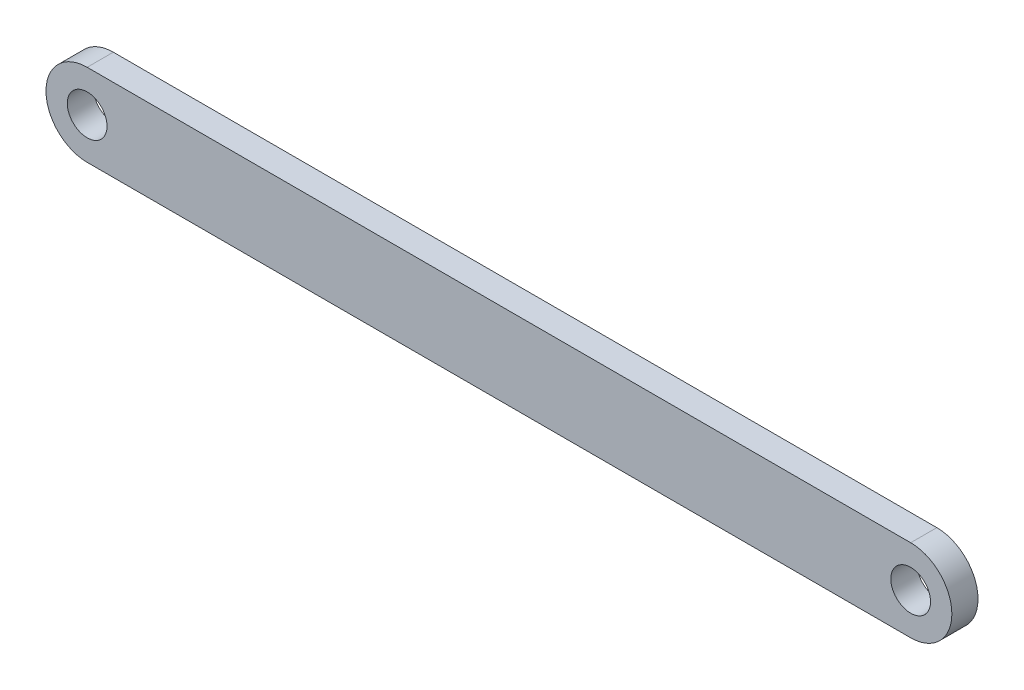
ISO-10303-21;
HEADER;
FILE_DESCRIPTION(('STEP AP214'),'2;1');
FILE_NAME('part.step','',(''),(''),'','','');
FILE_SCHEMA(('AUTOMOTIVE_DESIGN { 1 0 10303 214 1 1 1 1 }'));
ENDSEC;
DATA;
#1=APPLICATION_CONTEXT('core data for automotive mechanical design processes');
#2=APPLICATION_PROTOCOL_DEFINITION('international standard','automotive_design',2000,#1);
#3=PRODUCT_CONTEXT('',#1,'mechanical');
#4=PRODUCT('Part','Part','',(#3));
#5=PRODUCT_RELATED_PRODUCT_CATEGORY('part','',(#4));
#6=PRODUCT_DEFINITION_FORMATION('','',#4);
#7=PRODUCT_DEFINITION_CONTEXT('part definition',#1,'design');
#8=PRODUCT_DEFINITION('design','',#6,#7);
#9=PRODUCT_DEFINITION_SHAPE('','',#8);
#10=(LENGTH_UNIT() NAMED_UNIT(*) SI_UNIT(.MILLI.,.METRE.));
#11=(NAMED_UNIT(*) PLANE_ANGLE_UNIT() SI_UNIT($,.RADIAN.));
#12=(NAMED_UNIT(*) SI_UNIT($,.STERADIAN.) SOLID_ANGLE_UNIT());
#13=UNCERTAINTY_MEASURE_WITH_UNIT(LENGTH_MEASURE(1.E-05),#10,'distance_accuracy_value','');
#14=(GEOMETRIC_REPRESENTATION_CONTEXT(3) GLOBAL_UNCERTAINTY_ASSIGNED_CONTEXT((#13)) GLOBAL_UNIT_ASSIGNED_CONTEXT((#10,
#11,#12)) REPRESENTATION_CONTEXT('',''));
#15=CARTESIAN_POINT('',(0.,0.,0.));
#16=DIRECTION('',(0.,0.,1.));
#17=DIRECTION('',(1.,0.,0.));
#18=AXIS2_PLACEMENT_3D('',#15,#16,#17);
#19=CARTESIAN_POINT('',(-50.,0.,3.175));
#20=DIRECTION('',(0.,0.,1.));
#21=DIRECTION('',(1.,0.,0.));
#22=AXIS2_PLACEMENT_3D('',#19,#20,#21);
#23=PLANE('',#22);
#24=CARTESIAN_POINT('',(-50.,0.,3.175));
#25=DIRECTION('',(0.,0.,1.));
#26=DIRECTION('',(1.,0.,0.));
#27=AXIS2_PLACEMENT_3D('',#24,#25,#26);
#28=CIRCLE('',#27,2.413);
#29=CARTESIAN_POINT('',(-47.587,0.,3.175));
#30=VERTEX_POINT('',#29);
#31=EDGE_CURVE('E117',#30,#30,#28,.T.);
#32=ORIENTED_EDGE('',*,*,#31,.F.);
#33=EDGE_LOOP('',(#32));
#34=FACE_BOUND('',#33,.T.);
#35=CARTESIAN_POINT('',(-50.,0.,3.175));
#36=DIRECTION('',(0.,0.,1.));
#37=DIRECTION('',(1.,0.,0.));
#38=AXIS2_PLACEMENT_3D('',#35,#36,#37);
#39=CIRCLE('',#38,5.);
#40=CARTESIAN_POINT('',(-50.,5.,3.175));
#41=VERTEX_POINT('',#40);
#42=CARTESIAN_POINT('',(-50.,-5.,3.175));
#43=VERTEX_POINT('',#42);
#44=EDGE_CURVE('E97',#41,#43,#39,.T.);
#45=ORIENTED_EDGE('',*,*,#44,.T.);
#46=DIRECTION('',(1.,0.,0.));
#47=VECTOR('',#46,1.);
#48=CARTESIAN_POINT('',(-50.,-5.,3.175));
#49=LINE('',#48,#47);
#50=CARTESIAN_POINT('',(50.,-4.99999999999998,3.175));
#51=VERTEX_POINT('',#50);
#52=EDGE_CURVE('E92',#43,#51,#49,.T.);
#53=ORIENTED_EDGE('',*,*,#52,.T.);
#54=CARTESIAN_POINT('',(50.,0.,3.175));
#55=DIRECTION('',(0.,0.,1.));
#56=DIRECTION('',(1.,0.,0.));
#57=AXIS2_PLACEMENT_3D('',#54,#55,#56);
#58=CIRCLE('',#57,5.);
#59=CARTESIAN_POINT('',(50.,5.00000000000002,3.175));
#60=VERTEX_POINT('',#59);
#61=EDGE_CURVE('E95',#51,#60,#58,.T.);
#62=ORIENTED_EDGE('',*,*,#61,.T.);
#63=DIRECTION('',(-1.,0.,0.));
#64=VECTOR('',#63,1.);
#65=CARTESIAN_POINT('',(-50.,5.,3.175));
#66=LINE('',#65,#64);
#67=EDGE_CURVE('E59',#60,#41,#66,.T.);
#68=ORIENTED_EDGE('',*,*,#67,.T.);
#69=EDGE_LOOP('',(#45,#53,#62,#68));
#70=FACE_BOUND('',#69,.T.);
#71=CARTESIAN_POINT('',(50.,0.,3.175));
#72=DIRECTION('',(0.,0.,1.));
#73=DIRECTION('',(1.,0.,0.));
#74=AXIS2_PLACEMENT_3D('',#71,#72,#73);
#75=CIRCLE('',#74,2.413);
#76=CARTESIAN_POINT('',(52.413,0.,3.175));
#77=VERTEX_POINT('',#76);
#78=EDGE_CURVE('E140',#77,#77,#75,.T.);
#79=ORIENTED_EDGE('',*,*,#78,.F.);
#80=EDGE_LOOP('',(#79));
#81=FACE_BOUND('',#80,.T.);
#82=ADVANCED_FACE('F38',(#34,#70,#81),#23,.T.);
#83=CARTESIAN_POINT('',(-50.,0.,0.));
#84=DIRECTION('',(0.,0.,1.));
#85=DIRECTION('',(1.,0.,0.));
#86=AXIS2_PLACEMENT_3D('',#83,#84,#85);
#87=PLANE('',#86);
#88=CARTESIAN_POINT('',(-50.,0.,0.));
#89=DIRECTION('',(0.,0.,1.));
#90=DIRECTION('',(1.,0.,0.));
#91=AXIS2_PLACEMENT_3D('',#88,#89,#90);
#92=CIRCLE('',#91,5.);
#93=CARTESIAN_POINT('',(-50.,5.,0.));
#94=VERTEX_POINT('',#93);
#95=CARTESIAN_POINT('',(-50.,-5.,0.));
#96=VERTEX_POINT('',#95);
#97=EDGE_CURVE('E113',#94,#96,#92,.T.);
#98=ORIENTED_EDGE('',*,*,#97,.F.);
#99=DIRECTION('',(-1.,0.,0.));
#100=VECTOR('',#99,1.);
#101=CARTESIAN_POINT('',(-50.,5.,0.));
#102=LINE('',#101,#100);
#103=CARTESIAN_POINT('',(50.,5.00000000000002,0.));
#104=VERTEX_POINT('',#103);
#105=EDGE_CURVE('E85',#104,#94,#102,.T.);
#106=ORIENTED_EDGE('',*,*,#105,.F.);
#107=CARTESIAN_POINT('',(50.,0.,0.));
#108=DIRECTION('',(0.,0.,1.));
#109=DIRECTION('',(1.,0.,0.));
#110=AXIS2_PLACEMENT_3D('',#107,#108,#109);
#111=CIRCLE('',#110,5.);
#112=CARTESIAN_POINT('',(50.,-4.99999999999998,0.));
#113=VERTEX_POINT('',#112);
#114=EDGE_CURVE('E79',#113,#104,#111,.T.);
#115=ORIENTED_EDGE('',*,*,#114,.F.);
#116=DIRECTION('',(1.,0.,0.));
#117=VECTOR('',#116,1.);
#118=CARTESIAN_POINT('',(-50.,-5.,0.));
#119=LINE('',#118,#117);
#120=EDGE_CURVE('E102',#96,#113,#119,.T.);
#121=ORIENTED_EDGE('',*,*,#120,.F.);
#122=EDGE_LOOP('',(#98,#106,#115,#121));
#123=FACE_BOUND('',#122,.T.);
#124=CARTESIAN_POINT('',(-50.,0.,0.));
#125=DIRECTION('',(0.,0.,1.));
#126=DIRECTION('',(1.,0.,0.));
#127=AXIS2_PLACEMENT_3D('',#124,#125,#126);
#128=CIRCLE('',#127,2.413);
#129=CARTESIAN_POINT('',(-47.587,0.,0.));
#130=VERTEX_POINT('',#129);
#131=EDGE_CURVE('E136',#130,#130,#128,.T.);
#132=ORIENTED_EDGE('',*,*,#131,.T.);
#133=EDGE_LOOP('',(#132));
#134=FACE_BOUND('',#133,.T.);
#135=CARTESIAN_POINT('',(50.,0.,0.));
#136=DIRECTION('',(0.,0.,1.));
#137=DIRECTION('',(1.,0.,0.));
#138=AXIS2_PLACEMENT_3D('',#135,#136,#137);
#139=CIRCLE('',#138,2.413);
#140=CARTESIAN_POINT('',(52.413,0.,0.));
#141=VERTEX_POINT('',#140);
#142=EDGE_CURVE('E143',#141,#141,#139,.T.);
#143=ORIENTED_EDGE('',*,*,#142,.T.);
#144=EDGE_LOOP('',(#143));
#145=FACE_BOUND('',#144,.T.);
#146=ADVANCED_FACE('F130',(#123,#134,#145),#87,.F.);
#147=CARTESIAN_POINT('',(-50.,0.,3.175));
#148=DIRECTION('',(0.,0.,-1.));
#149=DIRECTION('',(-1.,0.,0.));
#150=AXIS2_PLACEMENT_3D('',#147,#148,#149);
#151=CYLINDRICAL_SURFACE('',#150,5.);
#152=ORIENTED_EDGE('',*,*,#97,.T.);
#153=DIRECTION('',(0.,0.,-1.));
#154=VECTOR('',#153,1.);
#155=CARTESIAN_POINT('',(-50.,-5.,3.175));
#156=LINE('',#155,#154);
#157=EDGE_CURVE('E11',#43,#96,#156,.T.);
#158=ORIENTED_EDGE('',*,*,#157,.F.);
#159=ORIENTED_EDGE('',*,*,#44,.F.);
#160=DIRECTION('',(0.,0.,-1.));
#161=VECTOR('',#160,1.);
#162=CARTESIAN_POINT('',(-50.,5.,3.175));
#163=LINE('',#162,#161);
#164=EDGE_CURVE('E109',#41,#94,#163,.T.);
#165=ORIENTED_EDGE('',*,*,#164,.T.);
#166=EDGE_LOOP('',(#152,#158,#159,#165));
#167=FACE_BOUND('',#166,.T.);
#168=ADVANCED_FACE('F40',(#167),#151,.T.);
#169=CARTESIAN_POINT('',(-50.,-5.,3.175));
#170=DIRECTION('',(0.,1.,0.));
#171=DIRECTION('',(-1.,0.,0.));
#172=AXIS2_PLACEMENT_3D('',#169,#170,#171);
#173=PLANE('',#172);
#174=ORIENTED_EDGE('',*,*,#120,.T.);
#175=DIRECTION('',(0.,0.,-1.));
#176=VECTOR('',#175,1.);
#177=CARTESIAN_POINT('',(50.,-4.99999999999998,3.175));
#178=LINE('',#177,#176);
#179=EDGE_CURVE('E48',#51,#113,#178,.T.);
#180=ORIENTED_EDGE('',*,*,#179,.F.);
#181=ORIENTED_EDGE('',*,*,#52,.F.);
#182=ORIENTED_EDGE('',*,*,#157,.T.);
#183=EDGE_LOOP('',(#174,#180,#181,#182));
#184=FACE_BOUND('',#183,.T.);
#185=ADVANCED_FACE('F101',(#184),#173,.F.);
#186=CARTESIAN_POINT('',(50.,0.,3.175));
#187=DIRECTION('',(0.,0.,-1.));
#188=DIRECTION('',(-1.,0.,0.));
#189=AXIS2_PLACEMENT_3D('',#186,#187,#188);
#190=CYLINDRICAL_SURFACE('',#189,5.);
#191=ORIENTED_EDGE('',*,*,#114,.T.);
#192=DIRECTION('',(0.,0.,-1.));
#193=VECTOR('',#192,1.);
#194=CARTESIAN_POINT('',(50.,5.00000000000002,3.175));
#195=LINE('',#194,#193);
#196=EDGE_CURVE('E103',#60,#104,#195,.T.);
#197=ORIENTED_EDGE('',*,*,#196,.F.);
#198=ORIENTED_EDGE('',*,*,#61,.F.);
#199=ORIENTED_EDGE('',*,*,#179,.T.);
#200=EDGE_LOOP('',(#191,#197,#198,#199));
#201=FACE_BOUND('',#200,.T.);
#202=ADVANCED_FACE('F104',(#201),#190,.T.);
#203=CARTESIAN_POINT('',(-50.,5.,3.175));
#204=DIRECTION('',(0.,-1.,0.));
#205=DIRECTION('',(1.,0.,0.));
#206=AXIS2_PLACEMENT_3D('',#203,#204,#205);
#207=PLANE('',#206);
#208=ORIENTED_EDGE('',*,*,#105,.T.);
#209=ORIENTED_EDGE('',*,*,#164,.F.);
#210=ORIENTED_EDGE('',*,*,#67,.F.);
#211=ORIENTED_EDGE('',*,*,#196,.T.);
#212=EDGE_LOOP('',(#208,#209,#210,#211));
#213=FACE_BOUND('',#212,.T.);
#214=ADVANCED_FACE('F127',(#213),#207,.F.);
#215=CARTESIAN_POINT('',(-50.,0.,3.175));
#216=DIRECTION('',(0.,0.,-1.));
#217=DIRECTION('',(-1.,0.,0.));
#218=AXIS2_PLACEMENT_3D('',#215,#216,#217);
#219=CYLINDRICAL_SURFACE('',#218,2.413);
#220=ORIENTED_EDGE('',*,*,#31,.T.);
#221=EDGE_LOOP('',(#220));
#222=FACE_BOUND('',#221,.T.);
#223=ORIENTED_EDGE('',*,*,#131,.F.);
#224=EDGE_LOOP('',(#223));
#225=FACE_BOUND('',#224,.T.);
#226=ADVANCED_FACE('F161',(#222,#225),#219,.F.);
#227=CARTESIAN_POINT('',(50.,0.,3.175));
#228=DIRECTION('',(0.,0.,-1.));
#229=DIRECTION('',(-1.,0.,0.));
#230=AXIS2_PLACEMENT_3D('',#227,#228,#229);
#231=CYLINDRICAL_SURFACE('',#230,2.413);
#232=ORIENTED_EDGE('',*,*,#78,.T.);
#233=EDGE_LOOP('',(#232));
#234=FACE_BOUND('',#233,.T.);
#235=ORIENTED_EDGE('',*,*,#142,.F.);
#236=EDGE_LOOP('',(#235));
#237=FACE_BOUND('',#236,.T.);
#238=ADVANCED_FACE('F150',(#234,#237),#231,.F.);
#239=CLOSED_SHELL('',(#82,#146,#168,#185,#202,#214,#226,#238));
#240=MANIFOLD_SOLID_BREP('B2',#239);
#241=ADVANCED_BREP_SHAPE_REPRESENTATION('',(#18,#240),#14);
#242=SHAPE_DEFINITION_REPRESENTATION(#9,#241);
ENDSEC;
END-ISO-10303-21;
